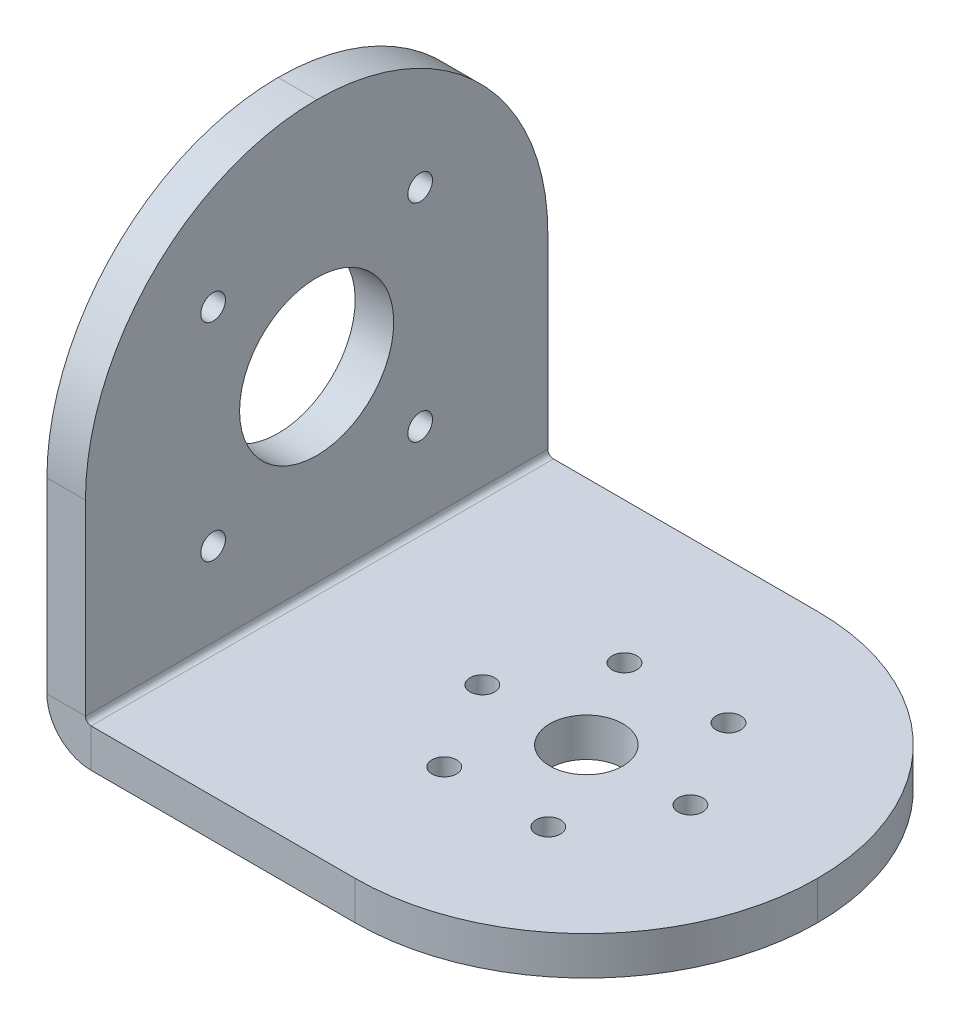
ISO-10303-21;
HEADER;
FILE_DESCRIPTION(('STEP AP214'),'2;1');
FILE_NAME('part.step','',(''),(''),'','','');
FILE_SCHEMA(('AUTOMOTIVE_DESIGN { 1 0 10303 214 1 1 1 1 }'));
ENDSEC;
DATA;
#1=APPLICATION_CONTEXT('core data for automotive mechanical design processes');
#2=APPLICATION_PROTOCOL_DEFINITION('international standard','automotive_design',2000,#1);
#3=PRODUCT_CONTEXT('',#1,'mechanical');
#4=PRODUCT('Part','Part','',(#3));
#5=PRODUCT_RELATED_PRODUCT_CATEGORY('part','',(#4));
#6=PRODUCT_DEFINITION_FORMATION('','',#4);
#7=PRODUCT_DEFINITION_CONTEXT('part definition',#1,'design');
#8=PRODUCT_DEFINITION('design','',#6,#7);
#9=PRODUCT_DEFINITION_SHAPE('','',#8);
#10=(LENGTH_UNIT() NAMED_UNIT(*) SI_UNIT(.MILLI.,.METRE.));
#11=(NAMED_UNIT(*) PLANE_ANGLE_UNIT() SI_UNIT($,.RADIAN.));
#12=(NAMED_UNIT(*) SI_UNIT($,.STERADIAN.) SOLID_ANGLE_UNIT());
#13=UNCERTAINTY_MEASURE_WITH_UNIT(LENGTH_MEASURE(1.E-05),#10,'distance_accuracy_value','');
#14=(GEOMETRIC_REPRESENTATION_CONTEXT(3) GLOBAL_UNCERTAINTY_ASSIGNED_CONTEXT((#13)) GLOBAL_UNIT_ASSIGNED_CONTEXT((#10,
#11,#12)) REPRESENTATION_CONTEXT('',''));
#15=CARTESIAN_POINT('',(0.,0.,0.));
#16=DIRECTION('',(0.,0.,1.));
#17=DIRECTION('',(1.,0.,0.));
#18=AXIS2_PLACEMENT_3D('',#15,#16,#17);
#19=CARTESIAN_POINT('',(0.,60.,30.));
#20=DIRECTION('',(1.,0.,0.));
#21=DIRECTION('',(0.,1.,0.));
#22=AXIS2_PLACEMENT_3D('',#19,#20,#21);
#23=PLANE('',#22);
#24=CARTESIAN_POINT('',(0.,43.4350288425444,-13.4350288425444));
#25=DIRECTION('',(-1.,0.,0.));
#26=DIRECTION('',(0.,0.,1.));
#27=AXIS2_PLACEMENT_3D('',#24,#25,#26);
#28=CIRCLE('',#27,1.60000000000002);
#29=CARTESIAN_POINT('',(0.,43.4350288425444,-11.8350288425444));
#30=VERTEX_POINT('',#29);
#31=EDGE_CURVE('E308',#30,#30,#28,.T.);
#32=ORIENTED_EDGE('',*,*,#31,.F.);
#33=EDGE_LOOP('',(#32));
#34=FACE_BOUND('',#33,.T.);
#35=CARTESIAN_POINT('',(0.,16.5649711574556,-13.4350288425444));
#36=DIRECTION('',(-1.,0.,0.));
#37=DIRECTION('',(0.,0.,1.));
#38=AXIS2_PLACEMENT_3D('',#35,#36,#37);
#39=CIRCLE('',#38,1.60000000000001);
#40=CARTESIAN_POINT('',(0.,16.5649711574556,-11.8350288425444));
#41=VERTEX_POINT('',#40);
#42=EDGE_CURVE('E302',#41,#41,#39,.T.);
#43=ORIENTED_EDGE('',*,*,#42,.F.);
#44=EDGE_LOOP('',(#43));
#45=FACE_BOUND('',#44,.T.);
#46=CARTESIAN_POINT('',(0.,30.,0.));
#47=DIRECTION('',(-1.,0.,0.));
#48=DIRECTION('',(0.,-1.,0.));
#49=AXIS2_PLACEMENT_3D('',#46,#47,#48);
#50=CIRCLE('',#49,10.);
#51=CARTESIAN_POINT('',(0.,20.,0.));
#52=VERTEX_POINT('',#51);
#53=EDGE_CURVE('E290',#52,#52,#50,.T.);
#54=ORIENTED_EDGE('',*,*,#53,.F.);
#55=EDGE_LOOP('',(#54));
#56=FACE_BOUND('',#55,.T.);
#57=CARTESIAN_POINT('',(0.,30.,0.));
#58=DIRECTION('',(1.,0.,0.));
#59=DIRECTION('',(0.,1.,0.));
#60=AXIS2_PLACEMENT_3D('',#57,#58,#59);
#61=CIRCLE('',#60,30.);
#62=CARTESIAN_POINT('',(0.,30.,30.));
#63=VERTEX_POINT('',#62);
#64=CARTESIAN_POINT('',(0.,60.,0.));
#65=VERTEX_POINT('',#64);
#66=EDGE_CURVE('E60',#63,#65,#61,.F.);
#67=ORIENTED_EDGE('',*,*,#66,.T.);
#68=CARTESIAN_POINT('',(0.,30.,0.));
#69=DIRECTION('',(1.,0.,0.));
#70=DIRECTION('',(0.,1.,0.));
#71=AXIS2_PLACEMENT_3D('',#68,#69,#70);
#72=CIRCLE('',#71,30.);
#73=CARTESIAN_POINT('',(0.,30.,-30.));
#74=VERTEX_POINT('',#73);
#75=EDGE_CURVE('E52',#65,#74,#72,.F.);
#76=ORIENTED_EDGE('',*,*,#75,.T.);
#77=DIRECTION('',(0.,-1.,0.));
#78=VECTOR('',#77,1.);
#79=CARTESIAN_POINT('',(0.,60.,-30.));
#80=LINE('',#79,#78);
#81=CARTESIAN_POINT('',(0.,5.7366,-30.));
#82=VERTEX_POINT('',#81);
#83=EDGE_CURVE('E178',#74,#82,#80,.T.);
#84=ORIENTED_EDGE('',*,*,#83,.T.);
#85=DIRECTION('',(0.,0.,-1.));
#86=VECTOR('',#85,1.);
#87=CARTESIAN_POINT('',(0.,5.7366,30.));
#88=LINE('',#87,#86);
#89=CARTESIAN_POINT('',(0.,5.7366,30.));
#90=VERTEX_POINT('',#89);
#91=EDGE_CURVE('E185',#90,#82,#88,.T.);
#92=ORIENTED_EDGE('',*,*,#91,.F.);
#93=DIRECTION('',(0.,-1.,0.));
#94=VECTOR('',#93,1.);
#95=CARTESIAN_POINT('',(0.,60.,30.));
#96=LINE('',#95,#94);
#97=EDGE_CURVE('E162',#63,#90,#96,.T.);
#98=ORIENTED_EDGE('',*,*,#97,.F.);
#99=EDGE_LOOP('',(#67,#76,#84,#92,#98));
#100=FACE_BOUND('',#99,.T.);
#101=CARTESIAN_POINT('',(0.,16.5649711574556,13.4350288425444));
#102=DIRECTION('',(-1.,0.,0.));
#103=DIRECTION('',(0.,0.,1.));
#104=AXIS2_PLACEMENT_3D('',#101,#102,#103);
#105=CIRCLE('',#104,1.60000000000001);
#106=CARTESIAN_POINT('',(0.,16.5649711574556,15.0350288425444));
#107=VERTEX_POINT('',#106);
#108=EDGE_CURVE('E296',#107,#107,#105,.T.);
#109=ORIENTED_EDGE('',*,*,#108,.F.);
#110=EDGE_LOOP('',(#109));
#111=FACE_BOUND('',#110,.T.);
#112=CARTESIAN_POINT('',(0.,43.4350288425444,13.4350288425444));
#113=DIRECTION('',(-1.,0.,0.));
#114=DIRECTION('',(0.,0.,1.));
#115=AXIS2_PLACEMENT_3D('',#112,#113,#114);
#116=CIRCLE('',#115,1.60000000000001);
#117=CARTESIAN_POINT('',(0.,43.4350288425444,15.0350288425444));
#118=VERTEX_POINT('',#117);
#119=EDGE_CURVE('E216',#118,#118,#116,.T.);
#120=ORIENTED_EDGE('',*,*,#119,.F.);
#121=EDGE_LOOP('',(#120));
#122=FACE_BOUND('',#121,.T.);
#123=ADVANCED_FACE('F43',(#34,#45,#56,#100,#111,#122),#23,.F.);
#124=CARTESIAN_POINT('',(0.,5.7366,30.));
#125=DIRECTION('',(0.,0.,1.));
#126=DIRECTION('',(1.,0.,0.));
#127=AXIS2_PLACEMENT_3D('',#124,#125,#126);
#128=PLANE('',#127);
#129=DIRECTION('',(1.,0.,0.));
#130=VECTOR('',#129,1.);
#131=CARTESIAN_POINT('',(0.,5.7366,30.));
#132=LINE('',#131,#130);
#133=CARTESIAN_POINT('',(5.,5.7366,30.));
#134=VERTEX_POINT('',#133);
#135=EDGE_CURVE('E133',#90,#134,#132,.T.);
#136=ORIENTED_EDGE('',*,*,#135,.F.);
#137=CARTESIAN_POINT('',(5.7366,5.7366,30.));
#138=DIRECTION('',(0.,0.,1.));
#139=DIRECTION('',(1.,0.,0.));
#140=AXIS2_PLACEMENT_3D('',#137,#138,#139);
#141=CIRCLE('',#140,5.7366);
#142=CARTESIAN_POINT('',(5.73659999999999,0.,30.));
#143=VERTEX_POINT('',#142);
#144=EDGE_CURVE('E128',#90,#143,#141,.T.);
#145=ORIENTED_EDGE('',*,*,#144,.T.);
#146=DIRECTION('',(0.,-1.,0.));
#147=VECTOR('',#146,1.);
#148=CARTESIAN_POINT('',(5.73659999999999,5.,30.));
#149=LINE('',#148,#147);
#150=CARTESIAN_POINT('',(5.73659999999999,5.,30.));
#151=VERTEX_POINT('',#150);
#152=EDGE_CURVE('E121',#151,#143,#149,.T.);
#153=ORIENTED_EDGE('',*,*,#152,.F.);
#154=CARTESIAN_POINT('',(5.7366,5.7366,30.));
#155=DIRECTION('',(0.,0.,1.));
#156=DIRECTION('',(1.,0.,0.));
#157=AXIS2_PLACEMENT_3D('',#154,#155,#156);
#158=CIRCLE('',#157,0.7366);
#159=EDGE_CURVE('E126',#134,#151,#158,.T.);
#160=ORIENTED_EDGE('',*,*,#159,.F.);
#161=EDGE_LOOP('',(#136,#145,#153,#160));
#162=FACE_BOUND('',#161,.T.);
#163=ADVANCED_FACE('F124',(#162),#128,.T.);
#164=CARTESIAN_POINT('',(5.73659999999999,5.,30.));
#165=DIRECTION('',(0.,0.,1.));
#166=DIRECTION('',(1.,0.,0.));
#167=AXIS2_PLACEMENT_3D('',#164,#165,#166);
#168=PLANE('',#167);
#169=DIRECTION('',(0.,-1.,0.));
#170=VECTOR('',#169,1.);
#171=CARTESIAN_POINT('',(5.,60.,30.));
#172=LINE('',#171,#170);
#173=CARTESIAN_POINT('',(5.,30.,30.));
#174=VERTEX_POINT('',#173);
#175=EDGE_CURVE('E160',#174,#134,#172,.T.);
#176=ORIENTED_EDGE('',*,*,#175,.F.);
#177=DIRECTION('',(1.,0.,0.));
#178=VECTOR('',#177,1.);
#179=CARTESIAN_POINT('',(5.73659999999999,30.,30.));
#180=LINE('',#179,#178);
#181=EDGE_CURVE('E11',#174,#63,#180,.F.);
#182=ORIENTED_EDGE('',*,*,#181,.T.);
#183=ORIENTED_EDGE('',*,*,#97,.T.);
#184=ORIENTED_EDGE('',*,*,#135,.T.);
#185=EDGE_LOOP('',(#176,#182,#183,#184));
#186=FACE_BOUND('',#185,.T.);
#187=ADVANCED_FACE('F233',(#186),#168,.T.);
#188=CARTESIAN_POINT('',(5.73659999999999,0.,-30.));
#189=DIRECTION('',(0.,0.,-1.));
#190=DIRECTION('',(-1.,0.,0.));
#191=AXIS2_PLACEMENT_3D('',#188,#189,#190);
#192=PLANE('',#191);
#193=DIRECTION('',(0.,1.,0.));
#194=VECTOR('',#193,1.);
#195=CARTESIAN_POINT('',(5.73659999999999,0.,-30.));
#196=LINE('',#195,#194);
#197=CARTESIAN_POINT('',(5.73659999999999,0.,-30.));
#198=VERTEX_POINT('',#197);
#199=CARTESIAN_POINT('',(5.73659999999999,5.,-30.));
#200=VERTEX_POINT('',#199);
#201=EDGE_CURVE('E134',#198,#200,#196,.T.);
#202=ORIENTED_EDGE('',*,*,#201,.F.);
#203=CARTESIAN_POINT('',(5.7366,5.7366,-30.));
#204=DIRECTION('',(0.,0.,1.));
#205=DIRECTION('',(1.,0.,0.));
#206=AXIS2_PLACEMENT_3D('',#203,#204,#205);
#207=CIRCLE('',#206,5.7366);
#208=EDGE_CURVE('E180',#82,#198,#207,.T.);
#209=ORIENTED_EDGE('',*,*,#208,.F.);
#210=DIRECTION('',(-1.,0.,0.));
#211=VECTOR('',#210,1.);
#212=CARTESIAN_POINT('',(5.,5.7366,-30.));
#213=LINE('',#212,#211);
#214=CARTESIAN_POINT('',(5.,5.7366,-30.));
#215=VERTEX_POINT('',#214);
#216=EDGE_CURVE('E149',#215,#82,#213,.T.);
#217=ORIENTED_EDGE('',*,*,#216,.F.);
#218=CARTESIAN_POINT('',(5.7366,5.7366,-30.));
#219=DIRECTION('',(0.,0.,1.));
#220=DIRECTION('',(1.,0.,0.));
#221=AXIS2_PLACEMENT_3D('',#218,#219,#220);
#222=CIRCLE('',#221,0.7366);
#223=EDGE_CURVE('E174',#215,#200,#222,.T.);
#224=ORIENTED_EDGE('',*,*,#223,.T.);
#225=EDGE_LOOP('',(#202,#209,#217,#224));
#226=FACE_BOUND('',#225,.T.);
#227=ADVANCED_FACE('F360',(#226),#192,.T.);
#228=CARTESIAN_POINT('',(5.,5.7366,-30.));
#229=DIRECTION('',(0.,0.,-1.));
#230=DIRECTION('',(-1.,0.,0.));
#231=AXIS2_PLACEMENT_3D('',#228,#229,#230);
#232=PLANE('',#231);
#233=DIRECTION('',(1.,0.,0.));
#234=VECTOR('',#233,1.);
#235=CARTESIAN_POINT('',(70.,5.,-30.));
#236=LINE('',#235,#234);
#237=CARTESIAN_POINT('',(40.,5.,-30.));
#238=VERTEX_POINT('',#237);
#239=EDGE_CURVE('E145',#200,#238,#236,.T.);
#240=ORIENTED_EDGE('',*,*,#239,.T.);
#241=DIRECTION('',(0.,-1.,0.));
#242=VECTOR('',#241,1.);
#243=CARTESIAN_POINT('',(40.,5.7366,-30.));
#244=LINE('',#243,#242);
#245=CARTESIAN_POINT('',(40.,0.,-30.));
#246=VERTEX_POINT('',#245);
#247=EDGE_CURVE('E194',#238,#246,#244,.T.);
#248=ORIENTED_EDGE('',*,*,#247,.T.);
#249=DIRECTION('',(1.,0.,0.));
#250=VECTOR('',#249,1.);
#251=CARTESIAN_POINT('',(70.,0.,-30.));
#252=LINE('',#251,#250);
#253=EDGE_CURVE('E169',#198,#246,#252,.T.);
#254=ORIENTED_EDGE('',*,*,#253,.F.);
#255=ORIENTED_EDGE('',*,*,#201,.T.);
#256=EDGE_LOOP('',(#240,#248,#254,#255));
#257=FACE_BOUND('',#256,.T.);
#258=ADVANCED_FACE('F356',(#257),#232,.T.);
#259=CARTESIAN_POINT('',(70.,0.,30.));
#260=DIRECTION('',(0.,1.,0.));
#261=DIRECTION('',(-1.,0.,0.));
#262=AXIS2_PLACEMENT_3D('',#259,#260,#261);
#263=PLANE('',#262);
#264=CARTESIAN_POINT('',(46.75,0.,11.6913429510899));
#265=DIRECTION('',(0.,1.,0.));
#266=DIRECTION('',(-1.,0.,0.));
#267=AXIS2_PLACEMENT_3D('',#264,#265,#266);
#268=CIRCLE('',#267,1.60000000000001);
#269=CARTESIAN_POINT('',(45.15,0.,11.6913429510899));
#270=VERTEX_POINT('',#269);
#271=EDGE_CURVE('E281',#270,#270,#268,.T.);
#272=ORIENTED_EDGE('',*,*,#271,.T.);
#273=EDGE_LOOP('',(#272));
#274=FACE_BOUND('',#273,.T.);
#275=CARTESIAN_POINT('',(53.5,0.,0.));
#276=DIRECTION('',(0.,1.,0.));
#277=DIRECTION('',(-1.,0.,0.));
#278=AXIS2_PLACEMENT_3D('',#275,#276,#277);
#279=CIRCLE('',#278,1.60000000000001);
#280=CARTESIAN_POINT('',(51.9,0.,0.));
#281=VERTEX_POINT('',#280);
#282=EDGE_CURVE('E275',#281,#281,#279,.T.);
#283=ORIENTED_EDGE('',*,*,#282,.T.);
#284=EDGE_LOOP('',(#283));
#285=FACE_BOUND('',#284,.T.);
#286=CARTESIAN_POINT('',(46.75,0.,-11.6913429510899));
#287=DIRECTION('',(0.,1.,0.));
#288=DIRECTION('',(-1.,0.,0.));
#289=AXIS2_PLACEMENT_3D('',#286,#287,#288);
#290=CIRCLE('',#289,1.60000000000001);
#291=CARTESIAN_POINT('',(45.15,0.,-11.6913429510899));
#292=VERTEX_POINT('',#291);
#293=EDGE_CURVE('E269',#292,#292,#290,.T.);
#294=ORIENTED_EDGE('',*,*,#293,.T.);
#295=EDGE_LOOP('',(#294));
#296=FACE_BOUND('',#295,.T.);
#297=CARTESIAN_POINT('',(33.25,0.,-11.6913429510899));
#298=DIRECTION('',(0.,1.,0.));
#299=DIRECTION('',(-1.,0.,0.));
#300=AXIS2_PLACEMENT_3D('',#297,#298,#299);
#301=CIRCLE('',#300,1.60000000000001);
#302=CARTESIAN_POINT('',(31.65,0.,-11.6913429510899));
#303=VERTEX_POINT('',#302);
#304=EDGE_CURVE('E263',#303,#303,#301,.T.);
#305=ORIENTED_EDGE('',*,*,#304,.T.);
#306=EDGE_LOOP('',(#305));
#307=FACE_BOUND('',#306,.T.);
#308=CARTESIAN_POINT('',(26.5,0.,0.));
#309=DIRECTION('',(0.,1.,0.));
#310=DIRECTION('',(-1.,0.,0.));
#311=AXIS2_PLACEMENT_3D('',#308,#309,#310);
#312=CIRCLE('',#311,1.60000000000001);
#313=CARTESIAN_POINT('',(24.9,0.,0.));
#314=VERTEX_POINT('',#313);
#315=EDGE_CURVE('E257',#314,#314,#312,.T.);
#316=ORIENTED_EDGE('',*,*,#315,.T.);
#317=EDGE_LOOP('',(#316));
#318=FACE_BOUND('',#317,.T.);
#319=CARTESIAN_POINT('',(33.25,0.,11.6913429510899));
#320=DIRECTION('',(0.,1.,0.));
#321=DIRECTION('',(-1.,0.,0.));
#322=AXIS2_PLACEMENT_3D('',#319,#320,#321);
#323=CIRCLE('',#322,1.60000000000001);
#324=CARTESIAN_POINT('',(31.65,0.,11.6913429510899));
#325=VERTEX_POINT('',#324);
#326=EDGE_CURVE('E251',#325,#325,#323,.T.);
#327=ORIENTED_EDGE('',*,*,#326,.T.);
#328=EDGE_LOOP('',(#327));
#329=FACE_BOUND('',#328,.T.);
#330=CARTESIAN_POINT('',(40.,0.,0.));
#331=DIRECTION('',(0.,1.,0.));
#332=DIRECTION('',(-1.,0.,0.));
#333=AXIS2_PLACEMENT_3D('',#330,#331,#332);
#334=CIRCLE('',#333,4.75);
#335=CARTESIAN_POINT('',(35.25,0.,0.));
#336=VERTEX_POINT('',#335);
#337=EDGE_CURVE('E172',#336,#336,#334,.T.);
#338=ORIENTED_EDGE('',*,*,#337,.T.);
#339=EDGE_LOOP('',(#338));
#340=FACE_BOUND('',#339,.T.);
#341=ORIENTED_EDGE('',*,*,#253,.T.);
#342=CARTESIAN_POINT('',(40.,0.,0.));
#343=DIRECTION('',(0.,1.,0.));
#344=DIRECTION('',(-1.,0.,0.));
#345=AXIS2_PLACEMENT_3D('',#342,#343,#344);
#346=CIRCLE('',#345,30.);
#347=CARTESIAN_POINT('',(70.,0.,0.));
#348=VERTEX_POINT('',#347);
#349=EDGE_CURVE('E199',#246,#348,#346,.F.);
#350=ORIENTED_EDGE('',*,*,#349,.T.);
#351=CARTESIAN_POINT('',(40.,0.,0.));
#352=DIRECTION('',(0.,1.,0.));
#353=DIRECTION('',(-1.,0.,0.));
#354=AXIS2_PLACEMENT_3D('',#351,#352,#353);
#355=CIRCLE('',#354,30.);
#356=CARTESIAN_POINT('',(40.,0.,30.));
#357=VERTEX_POINT('',#356);
#358=EDGE_CURVE('E197',#348,#357,#355,.F.);
#359=ORIENTED_EDGE('',*,*,#358,.T.);
#360=DIRECTION('',(1.,0.,0.));
#361=VECTOR('',#360,1.);
#362=CARTESIAN_POINT('',(70.,0.,30.));
#363=LINE('',#362,#361);
#364=EDGE_CURVE('E155',#143,#357,#363,.T.);
#365=ORIENTED_EDGE('',*,*,#364,.F.);
#366=DIRECTION('',(0.,0.,-1.));
#367=VECTOR('',#366,1.);
#368=CARTESIAN_POINT('',(5.73659999999999,0.,30.));
#369=LINE('',#368,#367);
#370=EDGE_CURVE('E168',#143,#198,#369,.T.);
#371=ORIENTED_EDGE('',*,*,#370,.T.);
#372=EDGE_LOOP('',(#341,#350,#359,#365,#371));
#373=FACE_BOUND('',#372,.T.);
#374=ADVANCED_FACE('F243',(#274,#285,#296,#307,#318,#329,#340,#373),#263,.F.);
#375=CARTESIAN_POINT('',(70.,5.,30.));
#376=DIRECTION('',(0.,1.,0.));
#377=DIRECTION('',(-1.,0.,0.));
#378=AXIS2_PLACEMENT_3D('',#375,#376,#377);
#379=PLANE('',#378);
#380=CARTESIAN_POINT('',(46.75,5.,11.6913429510899));
#381=DIRECTION('',(0.,1.,0.));
#382=DIRECTION('',(0.,0.,1.));
#383=AXIS2_PLACEMENT_3D('',#380,#381,#382);
#384=CIRCLE('',#383,1.60000000000002);
#385=CARTESIAN_POINT('',(46.75,5.,13.2913429510899));
#386=VERTEX_POINT('',#385);
#387=EDGE_CURVE('E284',#386,#386,#384,.T.);
#388=ORIENTED_EDGE('',*,*,#387,.F.);
#389=EDGE_LOOP('',(#388));
#390=FACE_BOUND('',#389,.T.);
#391=CARTESIAN_POINT('',(53.5,5.,0.));
#392=DIRECTION('',(0.,1.,0.));
#393=DIRECTION('',(0.,0.,1.));
#394=AXIS2_PLACEMENT_3D('',#391,#392,#393);
#395=CIRCLE('',#394,1.60000000000001);
#396=CARTESIAN_POINT('',(53.5,5.,1.60000000000002));
#397=VERTEX_POINT('',#396);
#398=EDGE_CURVE('E278',#397,#397,#395,.T.);
#399=ORIENTED_EDGE('',*,*,#398,.F.);
#400=EDGE_LOOP('',(#399));
#401=FACE_BOUND('',#400,.T.);
#402=CARTESIAN_POINT('',(46.75,5.,-11.6913429510899));
#403=DIRECTION('',(0.,1.,0.));
#404=DIRECTION('',(0.,0.,1.));
#405=AXIS2_PLACEMENT_3D('',#402,#403,#404);
#406=CIRCLE('',#405,1.60000000000002);
#407=CARTESIAN_POINT('',(46.75,5.,-10.0913429510899));
#408=VERTEX_POINT('',#407);
#409=EDGE_CURVE('E272',#408,#408,#406,.T.);
#410=ORIENTED_EDGE('',*,*,#409,.F.);
#411=EDGE_LOOP('',(#410));
#412=FACE_BOUND('',#411,.T.);
#413=CARTESIAN_POINT('',(33.25,5.,-11.6913429510899));
#414=DIRECTION('',(0.,1.,0.));
#415=DIRECTION('',(0.,0.,1.));
#416=AXIS2_PLACEMENT_3D('',#413,#414,#415);
#417=CIRCLE('',#416,1.60000000000001);
#418=CARTESIAN_POINT('',(33.25,5.,-10.0913429510899));
#419=VERTEX_POINT('',#418);
#420=EDGE_CURVE('E266',#419,#419,#417,.T.);
#421=ORIENTED_EDGE('',*,*,#420,.F.);
#422=EDGE_LOOP('',(#421));
#423=FACE_BOUND('',#422,.T.);
#424=CARTESIAN_POINT('',(26.5,5.,0.));
#425=DIRECTION('',(0.,1.,0.));
#426=DIRECTION('',(0.,0.,1.));
#427=AXIS2_PLACEMENT_3D('',#424,#425,#426);
#428=CIRCLE('',#427,1.60000000000001);
#429=CARTESIAN_POINT('',(26.5,5.,1.60000000000001));
#430=VERTEX_POINT('',#429);
#431=EDGE_CURVE('E260',#430,#430,#428,.T.);
#432=ORIENTED_EDGE('',*,*,#431,.F.);
#433=EDGE_LOOP('',(#432));
#434=FACE_BOUND('',#433,.T.);
#435=CARTESIAN_POINT('',(33.25,5.,11.6913429510899));
#436=DIRECTION('',(0.,1.,0.));
#437=DIRECTION('',(0.,0.,1.));
#438=AXIS2_PLACEMENT_3D('',#435,#436,#437);
#439=CIRCLE('',#438,1.60000000000002);
#440=CARTESIAN_POINT('',(33.25,5.,13.2913429510899));
#441=VERTEX_POINT('',#440);
#442=EDGE_CURVE('E254',#441,#441,#439,.T.);
#443=ORIENTED_EDGE('',*,*,#442,.F.);
#444=EDGE_LOOP('',(#443));
#445=FACE_BOUND('',#444,.T.);
#446=CARTESIAN_POINT('',(40.,5.,0.));
#447=DIRECTION('',(0.,1.,0.));
#448=DIRECTION('',(-1.,0.,0.));
#449=AXIS2_PLACEMENT_3D('',#446,#447,#448);
#450=CIRCLE('',#449,4.75);
#451=CARTESIAN_POINT('',(35.25,5.,0.));
#452=VERTEX_POINT('',#451);
#453=EDGE_CURVE('E248',#452,#452,#450,.T.);
#454=ORIENTED_EDGE('',*,*,#453,.F.);
#455=EDGE_LOOP('',(#454));
#456=FACE_BOUND('',#455,.T.);
#457=CARTESIAN_POINT('',(40.,5.,0.));
#458=DIRECTION('',(0.,1.,0.));
#459=DIRECTION('',(-1.,0.,0.));
#460=AXIS2_PLACEMENT_3D('',#457,#458,#459);
#461=CIRCLE('',#460,30.);
#462=CARTESIAN_POINT('',(40.,5.,30.));
#463=VERTEX_POINT('',#462);
#464=CARTESIAN_POINT('',(70.,5.,0.));
#465=VERTEX_POINT('',#464);
#466=EDGE_CURVE('E201',#463,#465,#461,.T.);
#467=ORIENTED_EDGE('',*,*,#466,.T.);
#468=CARTESIAN_POINT('',(40.,5.,0.));
#469=DIRECTION('',(0.,1.,0.));
#470=DIRECTION('',(-1.,0.,0.));
#471=AXIS2_PLACEMENT_3D('',#468,#469,#470);
#472=CIRCLE('',#471,30.);
#473=EDGE_CURVE('E203',#465,#238,#472,.T.);
#474=ORIENTED_EDGE('',*,*,#473,.T.);
#475=ORIENTED_EDGE('',*,*,#239,.F.);
#476=DIRECTION('',(0.,0.,-1.));
#477=VECTOR('',#476,1.);
#478=CARTESIAN_POINT('',(5.73659999999999,5.,30.));
#479=LINE('',#478,#477);
#480=EDGE_CURVE('E140',#151,#200,#479,.T.);
#481=ORIENTED_EDGE('',*,*,#480,.F.);
#482=DIRECTION('',(1.,0.,0.));
#483=VECTOR('',#482,1.);
#484=CARTESIAN_POINT('',(70.,5.,30.));
#485=LINE('',#484,#483);
#486=EDGE_CURVE('E142',#151,#463,#485,.T.);
#487=ORIENTED_EDGE('',*,*,#486,.T.);
#488=EDGE_LOOP('',(#467,#474,#475,#481,#487));
#489=FACE_BOUND('',#488,.T.);
#490=ADVANCED_FACE('F141',(#390,#401,#412,#423,#434,#445,#456,#489),#379,.T.);
#491=CARTESIAN_POINT('',(5.7366,5.7366,30.));
#492=DIRECTION('',(0.,0.,-1.));
#493=DIRECTION('',(-1.,0.,0.));
#494=AXIS2_PLACEMENT_3D('',#491,#492,#493);
#495=CYLINDRICAL_SURFACE('',#494,0.7366);
#496=ORIENTED_EDGE('',*,*,#223,.F.);
#497=DIRECTION('',(0.,0.,-1.));
#498=VECTOR('',#497,1.);
#499=CARTESIAN_POINT('',(5.,5.7366,30.));
#500=LINE('',#499,#498);
#501=EDGE_CURVE('E150',#134,#215,#500,.T.);
#502=ORIENTED_EDGE('',*,*,#501,.F.);
#503=ORIENTED_EDGE('',*,*,#159,.T.);
#504=ORIENTED_EDGE('',*,*,#480,.T.);
#505=EDGE_LOOP('',(#496,#502,#503,#504));
#506=FACE_BOUND('',#505,.T.);
#507=ADVANCED_FACE('F158',(#506),#495,.F.);
#508=CARTESIAN_POINT('',(5.,60.,30.));
#509=DIRECTION('',(1.,0.,0.));
#510=DIRECTION('',(0.,1.,0.));
#511=AXIS2_PLACEMENT_3D('',#508,#509,#510);
#512=PLANE('',#511);
#513=CARTESIAN_POINT('',(5.,43.4350288425444,13.4350288425444));
#514=DIRECTION('',(1.,0.,0.));
#515=DIRECTION('',(0.,1.,0.));
#516=AXIS2_PLACEMENT_3D('',#513,#514,#515);
#517=CIRCLE('',#516,1.60000000000001);
#518=CARTESIAN_POINT('',(5.,45.0350288425444,13.4350288425444));
#519=VERTEX_POINT('',#518);
#520=EDGE_CURVE('E221',#519,#519,#517,.T.);
#521=ORIENTED_EDGE('',*,*,#520,.F.);
#522=EDGE_LOOP('',(#521));
#523=FACE_BOUND('',#522,.T.);
#524=CARTESIAN_POINT('',(5.,43.4350288425444,-13.4350288425444));
#525=DIRECTION('',(1.,0.,0.));
#526=DIRECTION('',(0.,1.,0.));
#527=AXIS2_PLACEMENT_3D('',#524,#525,#526);
#528=CIRCLE('',#527,1.60000000000001);
#529=CARTESIAN_POINT('',(5.,45.0350288425444,-13.4350288425444));
#530=VERTEX_POINT('',#529);
#531=EDGE_CURVE('E305',#530,#530,#528,.T.);
#532=ORIENTED_EDGE('',*,*,#531,.F.);
#533=EDGE_LOOP('',(#532));
#534=FACE_BOUND('',#533,.T.);
#535=CARTESIAN_POINT('',(5.,16.5649711574556,-13.4350288425444));
#536=DIRECTION('',(1.,0.,0.));
#537=DIRECTION('',(0.,1.,0.));
#538=AXIS2_PLACEMENT_3D('',#535,#536,#537);
#539=CIRCLE('',#538,1.60000000000001);
#540=CARTESIAN_POINT('',(5.,18.1649711574556,-13.4350288425444));
#541=VERTEX_POINT('',#540);
#542=EDGE_CURVE('E299',#541,#541,#539,.T.);
#543=ORIENTED_EDGE('',*,*,#542,.F.);
#544=EDGE_LOOP('',(#543));
#545=FACE_BOUND('',#544,.T.);
#546=CARTESIAN_POINT('',(5.,16.5649711574556,13.4350288425444));
#547=DIRECTION('',(1.,0.,0.));
#548=DIRECTION('',(0.,1.,0.));
#549=AXIS2_PLACEMENT_3D('',#546,#547,#548);
#550=CIRCLE('',#549,1.60000000000001);
#551=CARTESIAN_POINT('',(5.,18.1649711574556,13.4350288425444));
#552=VERTEX_POINT('',#551);
#553=EDGE_CURVE('E293',#552,#552,#550,.T.);
#554=ORIENTED_EDGE('',*,*,#553,.F.);
#555=EDGE_LOOP('',(#554));
#556=FACE_BOUND('',#555,.T.);
#557=CARTESIAN_POINT('',(5.,30.,0.));
#558=DIRECTION('',(1.,0.,0.));
#559=DIRECTION('',(0.,1.,0.));
#560=AXIS2_PLACEMENT_3D('',#557,#558,#559);
#561=CIRCLE('',#560,10.);
#562=CARTESIAN_POINT('',(5.,40.,0.));
#563=VERTEX_POINT('',#562);
#564=EDGE_CURVE('E287',#563,#563,#561,.T.);
#565=ORIENTED_EDGE('',*,*,#564,.F.);
#566=EDGE_LOOP('',(#565));
#567=FACE_BOUND('',#566,.T.);
#568=DIRECTION('',(0.,-1.,0.));
#569=VECTOR('',#568,1.);
#570=CARTESIAN_POINT('',(5.,60.,-30.));
#571=LINE('',#570,#569);
#572=CARTESIAN_POINT('',(5.,30.,-30.));
#573=VERTEX_POINT('',#572);
#574=EDGE_CURVE('E176',#573,#215,#571,.T.);
#575=ORIENTED_EDGE('',*,*,#574,.F.);
#576=CARTESIAN_POINT('',(5.,30.,0.));
#577=DIRECTION('',(1.,0.,0.));
#578=DIRECTION('',(0.,1.,0.));
#579=AXIS2_PLACEMENT_3D('',#576,#577,#578);
#580=CIRCLE('',#579,30.);
#581=CARTESIAN_POINT('',(5.,60.,0.));
#582=VERTEX_POINT('',#581);
#583=EDGE_CURVE('E211',#573,#582,#580,.T.);
#584=ORIENTED_EDGE('',*,*,#583,.T.);
#585=CARTESIAN_POINT('',(5.,30.,0.));
#586=DIRECTION('',(1.,0.,0.));
#587=DIRECTION('',(0.,1.,0.));
#588=AXIS2_PLACEMENT_3D('',#585,#586,#587);
#589=CIRCLE('',#588,30.);
#590=EDGE_CURVE('E209',#582,#174,#589,.T.);
#591=ORIENTED_EDGE('',*,*,#590,.T.);
#592=ORIENTED_EDGE('',*,*,#175,.T.);
#593=ORIENTED_EDGE('',*,*,#501,.T.);
#594=EDGE_LOOP('',(#575,#584,#591,#592,#593));
#595=FACE_BOUND('',#594,.T.);
#596=ADVANCED_FACE('F232',(#523,#534,#545,#556,#567,#595),#512,.T.);
#597=CARTESIAN_POINT('',(5.7366,5.7366,30.));
#598=DIRECTION('',(0.,0.,-1.));
#599=DIRECTION('',(-1.,0.,0.));
#600=AXIS2_PLACEMENT_3D('',#597,#598,#599);
#601=CYLINDRICAL_SURFACE('',#600,5.7366);
#602=ORIENTED_EDGE('',*,*,#208,.T.);
#603=ORIENTED_EDGE('',*,*,#370,.F.);
#604=ORIENTED_EDGE('',*,*,#144,.F.);
#605=ORIENTED_EDGE('',*,*,#91,.T.);
#606=EDGE_LOOP('',(#602,#603,#604,#605));
#607=FACE_BOUND('',#606,.T.);
#608=ADVANCED_FACE('F239',(#607),#601,.T.);
#609=CARTESIAN_POINT('',(5.7366,5.7366,30.));
#610=DIRECTION('',(0.,0.,1.));
#611=DIRECTION('',(1.,0.,0.));
#612=AXIS2_PLACEMENT_3D('',#609,#610,#611);
#613=PLANE('',#612);
#614=ORIENTED_EDGE('',*,*,#364,.T.);
#615=DIRECTION('',(0.,-1.,0.));
#616=VECTOR('',#615,1.);
#617=CARTESIAN_POINT('',(40.,5.7366,30.));
#618=LINE('',#617,#616);
#619=EDGE_CURVE('E154',#357,#463,#618,.F.);
#620=ORIENTED_EDGE('',*,*,#619,.T.);
#621=ORIENTED_EDGE('',*,*,#486,.F.);
#622=ORIENTED_EDGE('',*,*,#152,.T.);
#623=EDGE_LOOP('',(#614,#620,#621,#622));
#624=FACE_BOUND('',#623,.T.);
#625=ADVANCED_FACE('F152',(#624),#613,.T.);
#626=CARTESIAN_POINT('',(5.7366,5.7366,-30.));
#627=DIRECTION('',(0.,0.,1.));
#628=DIRECTION('',(1.,0.,0.));
#629=AXIS2_PLACEMENT_3D('',#626,#627,#628);
#630=PLANE('',#629);
#631=ORIENTED_EDGE('',*,*,#83,.F.);
#632=DIRECTION('',(1.,0.,0.));
#633=VECTOR('',#632,1.);
#634=CARTESIAN_POINT('',(5.,30.,-30.));
#635=LINE('',#634,#633);
#636=EDGE_CURVE('E206',#74,#573,#635,.T.);
#637=ORIENTED_EDGE('',*,*,#636,.T.);
#638=ORIENTED_EDGE('',*,*,#574,.T.);
#639=ORIENTED_EDGE('',*,*,#216,.T.);
#640=EDGE_LOOP('',(#631,#637,#638,#639));
#641=FACE_BOUND('',#640,.T.);
#642=ADVANCED_FACE('F393',(#641),#630,.F.);
#643=CARTESIAN_POINT('',(40.,-5.,0.));
#644=DIRECTION('',(0.,1.,0.));
#645=DIRECTION('',(-1.,0.,0.));
#646=AXIS2_PLACEMENT_3D('',#643,#644,#645);
#647=CYLINDRICAL_SURFACE('',#646,4.75);
#648=ORIENTED_EDGE('',*,*,#453,.T.);
#649=EDGE_LOOP('',(#648));
#650=FACE_BOUND('',#649,.T.);
#651=ORIENTED_EDGE('',*,*,#337,.F.);
#652=EDGE_LOOP('',(#651));
#653=FACE_BOUND('',#652,.T.);
#654=ADVANCED_FACE('F397',(#650,#653),#647,.F.);
#655=CARTESIAN_POINT('',(33.25,5.,11.6913429510899));
#656=DIRECTION('',(0.,1.,0.));
#657=DIRECTION('',(0.,0.,1.));
#658=AXIS2_PLACEMENT_3D('',#655,#656,#657);
#659=CYLINDRICAL_SURFACE('',#658,1.60000000000001);
#660=ORIENTED_EDGE('',*,*,#326,.F.);
#661=EDGE_LOOP('',(#660));
#662=FACE_BOUND('',#661,.T.);
#663=ORIENTED_EDGE('',*,*,#442,.T.);
#664=EDGE_LOOP('',(#663));
#665=FACE_BOUND('',#664,.T.);
#666=ADVANCED_FACE('F462',(#662,#665),#659,.F.);
#667=CARTESIAN_POINT('',(26.5,5.,0.));
#668=DIRECTION('',(0.,1.,0.));
#669=DIRECTION('',(0.,0.,1.));
#670=AXIS2_PLACEMENT_3D('',#667,#668,#669);
#671=CYLINDRICAL_SURFACE('',#670,1.60000000000001);
#672=ORIENTED_EDGE('',*,*,#315,.F.);
#673=EDGE_LOOP('',(#672));
#674=FACE_BOUND('',#673,.T.);
#675=ORIENTED_EDGE('',*,*,#431,.T.);
#676=EDGE_LOOP('',(#675));
#677=FACE_BOUND('',#676,.T.);
#678=ADVANCED_FACE('F471',(#674,#677),#671,.F.);
#679=CARTESIAN_POINT('',(33.25,5.,-11.6913429510899));
#680=DIRECTION('',(0.,1.,0.));
#681=DIRECTION('',(0.,0.,1.));
#682=AXIS2_PLACEMENT_3D('',#679,#680,#681);
#683=CYLINDRICAL_SURFACE('',#682,1.60000000000001);
#684=ORIENTED_EDGE('',*,*,#304,.F.);
#685=EDGE_LOOP('',(#684));
#686=FACE_BOUND('',#685,.T.);
#687=ORIENTED_EDGE('',*,*,#420,.T.);
#688=EDGE_LOOP('',(#687));
#689=FACE_BOUND('',#688,.T.);
#690=ADVANCED_FACE('F480',(#686,#689),#683,.F.);
#691=CARTESIAN_POINT('',(46.75,5.,-11.6913429510899));
#692=DIRECTION('',(0.,1.,0.));
#693=DIRECTION('',(0.,0.,1.));
#694=AXIS2_PLACEMENT_3D('',#691,#692,#693);
#695=CYLINDRICAL_SURFACE('',#694,1.60000000000001);
#696=ORIENTED_EDGE('',*,*,#293,.F.);
#697=EDGE_LOOP('',(#696));
#698=FACE_BOUND('',#697,.T.);
#699=ORIENTED_EDGE('',*,*,#409,.T.);
#700=EDGE_LOOP('',(#699));
#701=FACE_BOUND('',#700,.T.);
#702=ADVANCED_FACE('F489',(#698,#701),#695,.F.);
#703=CARTESIAN_POINT('',(53.5,5.,0.));
#704=DIRECTION('',(0.,1.,0.));
#705=DIRECTION('',(0.,0.,1.));
#706=AXIS2_PLACEMENT_3D('',#703,#704,#705);
#707=CYLINDRICAL_SURFACE('',#706,1.60000000000001);
#708=ORIENTED_EDGE('',*,*,#282,.F.);
#709=EDGE_LOOP('',(#708));
#710=FACE_BOUND('',#709,.T.);
#711=ORIENTED_EDGE('',*,*,#398,.T.);
#712=EDGE_LOOP('',(#711));
#713=FACE_BOUND('',#712,.T.);
#714=ADVANCED_FACE('F498',(#710,#713),#707,.F.);
#715=CARTESIAN_POINT('',(46.75,5.,11.6913429510899));
#716=DIRECTION('',(0.,1.,0.));
#717=DIRECTION('',(0.,0.,1.));
#718=AXIS2_PLACEMENT_3D('',#715,#716,#717);
#719=CYLINDRICAL_SURFACE('',#718,1.60000000000001);
#720=ORIENTED_EDGE('',*,*,#271,.F.);
#721=EDGE_LOOP('',(#720));
#722=FACE_BOUND('',#721,.T.);
#723=ORIENTED_EDGE('',*,*,#387,.T.);
#724=EDGE_LOOP('',(#723));
#725=FACE_BOUND('',#724,.T.);
#726=ADVANCED_FACE('F331',(#722,#725),#719,.F.);
#727=CARTESIAN_POINT('',(10.,30.,0.));
#728=DIRECTION('',(-1.,0.,0.));
#729=DIRECTION('',(0.,-1.,0.));
#730=AXIS2_PLACEMENT_3D('',#727,#728,#729);
#731=CYLINDRICAL_SURFACE('',#730,10.);
#732=ORIENTED_EDGE('',*,*,#564,.T.);
#733=EDGE_LOOP('',(#732));
#734=FACE_BOUND('',#733,.T.);
#735=ORIENTED_EDGE('',*,*,#53,.T.);
#736=EDGE_LOOP('',(#735));
#737=FACE_BOUND('',#736,.T.);
#738=ADVANCED_FACE('F327',(#734,#737),#731,.F.);
#739=CARTESIAN_POINT('',(0.,16.5649711574556,13.4350288425444));
#740=DIRECTION('',(-1.,0.,0.));
#741=DIRECTION('',(0.,0.,1.));
#742=AXIS2_PLACEMENT_3D('',#739,#740,#741);
#743=CYLINDRICAL_SURFACE('',#742,1.60000000000001);
#744=ORIENTED_EDGE('',*,*,#108,.T.);
#745=EDGE_LOOP('',(#744));
#746=FACE_BOUND('',#745,.T.);
#747=ORIENTED_EDGE('',*,*,#553,.T.);
#748=EDGE_LOOP('',(#747));
#749=FACE_BOUND('',#748,.T.);
#750=ADVANCED_FACE('F330',(#746,#749),#743,.F.);
#751=CARTESIAN_POINT('',(0.,16.5649711574556,-13.4350288425444));
#752=DIRECTION('',(-1.,0.,0.));
#753=DIRECTION('',(0.,0.,1.));
#754=AXIS2_PLACEMENT_3D('',#751,#752,#753);
#755=CYLINDRICAL_SURFACE('',#754,1.60000000000001);
#756=ORIENTED_EDGE('',*,*,#42,.T.);
#757=EDGE_LOOP('',(#756));
#758=FACE_BOUND('',#757,.T.);
#759=ORIENTED_EDGE('',*,*,#542,.T.);
#760=EDGE_LOOP('',(#759));
#761=FACE_BOUND('',#760,.T.);
#762=ADVANCED_FACE('F528',(#758,#761),#755,.F.);
#763=CARTESIAN_POINT('',(0.,43.4350288425444,-13.4350288425444));
#764=DIRECTION('',(-1.,0.,0.));
#765=DIRECTION('',(0.,0.,1.));
#766=AXIS2_PLACEMENT_3D('',#763,#764,#765);
#767=CYLINDRICAL_SURFACE('',#766,1.60000000000001);
#768=ORIENTED_EDGE('',*,*,#31,.T.);
#769=EDGE_LOOP('',(#768));
#770=FACE_BOUND('',#769,.T.);
#771=ORIENTED_EDGE('',*,*,#531,.T.);
#772=EDGE_LOOP('',(#771));
#773=FACE_BOUND('',#772,.T.);
#774=ADVANCED_FACE('F537',(#770,#773),#767,.F.);
#775=CARTESIAN_POINT('',(0.,43.4350288425444,13.4350288425444));
#776=DIRECTION('',(-1.,0.,0.));
#777=DIRECTION('',(0.,0.,1.));
#778=AXIS2_PLACEMENT_3D('',#775,#776,#777);
#779=CYLINDRICAL_SURFACE('',#778,1.60000000000001);
#780=ORIENTED_EDGE('',*,*,#119,.T.);
#781=EDGE_LOOP('',(#780));
#782=FACE_BOUND('',#781,.T.);
#783=ORIENTED_EDGE('',*,*,#520,.T.);
#784=EDGE_LOOP('',(#783));
#785=FACE_BOUND('',#784,.T.);
#786=ADVANCED_FACE('F314',(#782,#785),#779,.F.);
#787=CARTESIAN_POINT('',(40.,5.,0.));
#788=DIRECTION('',(0.,-1.,0.));
#789=DIRECTION('',(0.,0.,-1.));
#790=AXIS2_PLACEMENT_3D('',#787,#788,#789);
#791=CYLINDRICAL_SURFACE('',#790,30.);
#792=DIRECTION('',(0.,-1.,0.));
#793=VECTOR('',#792,1.);
#794=CARTESIAN_POINT('',(70.,5.,0.));
#795=LINE('',#794,#793);
#796=EDGE_CURVE('E214',#465,#348,#795,.T.);
#797=ORIENTED_EDGE('',*,*,#796,.F.);
#798=ORIENTED_EDGE('',*,*,#466,.F.);
#799=ORIENTED_EDGE('',*,*,#619,.F.);
#800=ORIENTED_EDGE('',*,*,#358,.F.);
#801=EDGE_LOOP('',(#797,#798,#799,#800));
#802=FACE_BOUND('',#801,.T.);
#803=ADVANCED_FACE('F369',(#802),#791,.T.);
#804=CARTESIAN_POINT('',(40.,5.7366,0.));
#805=DIRECTION('',(0.,-1.,0.));
#806=DIRECTION('',(0.,0.,-1.));
#807=AXIS2_PLACEMENT_3D('',#804,#805,#806);
#808=CYLINDRICAL_SURFACE('',#807,30.);
#809=ORIENTED_EDGE('',*,*,#473,.F.);
#810=ORIENTED_EDGE('',*,*,#796,.T.);
#811=ORIENTED_EDGE('',*,*,#349,.F.);
#812=ORIENTED_EDGE('',*,*,#247,.F.);
#813=EDGE_LOOP('',(#809,#810,#811,#812));
#814=FACE_BOUND('',#813,.T.);
#815=ADVANCED_FACE('F366',(#814),#808,.T.);
#816=CARTESIAN_POINT('',(0.,30.,0.));
#817=DIRECTION('',(1.,0.,0.));
#818=DIRECTION('',(0.,0.,-1.));
#819=AXIS2_PLACEMENT_3D('',#816,#817,#818);
#820=CYLINDRICAL_SURFACE('',#819,30.);
#821=DIRECTION('',(1.,0.,0.));
#822=VECTOR('',#821,1.);
#823=CARTESIAN_POINT('',(0.,60.,0.));
#824=LINE('',#823,#822);
#825=EDGE_CURVE('E47',#65,#582,#824,.T.);
#826=ORIENTED_EDGE('',*,*,#825,.F.);
#827=ORIENTED_EDGE('',*,*,#66,.F.);
#828=ORIENTED_EDGE('',*,*,#181,.F.);
#829=ORIENTED_EDGE('',*,*,#590,.F.);
#830=EDGE_LOOP('',(#826,#827,#828,#829));
#831=FACE_BOUND('',#830,.T.);
#832=ADVANCED_FACE('F45',(#831),#820,.T.);
#833=CARTESIAN_POINT('',(5.7366,30.,0.));
#834=DIRECTION('',(-1.,0.,0.));
#835=DIRECTION('',(0.,0.,1.));
#836=AXIS2_PLACEMENT_3D('',#833,#834,#835);
#837=CYLINDRICAL_SURFACE('',#836,30.);
#838=ORIENTED_EDGE('',*,*,#75,.F.);
#839=ORIENTED_EDGE('',*,*,#825,.T.);
#840=ORIENTED_EDGE('',*,*,#583,.F.);
#841=ORIENTED_EDGE('',*,*,#636,.F.);
#842=EDGE_LOOP('',(#838,#839,#840,#841));
#843=FACE_BOUND('',#842,.T.);
#844=ADVANCED_FACE('F226',(#843),#837,.T.);
#845=CLOSED_SHELL('',(#123,#163,#187,#227,#258,#374,#490,#507,#596,#608,#625,#642,#654,#666,
#678,#690,#702,#714,#726,#738,#750,#762,#774,#786,#803,#815,#832,#844));
#846=MANIFOLD_SOLID_BREP('B2',#845);
#847=ADVANCED_BREP_SHAPE_REPRESENTATION('',(#18,#846),#14);
#848=SHAPE_DEFINITION_REPRESENTATION(#9,#847);
ENDSEC;
END-ISO-10303-21;
